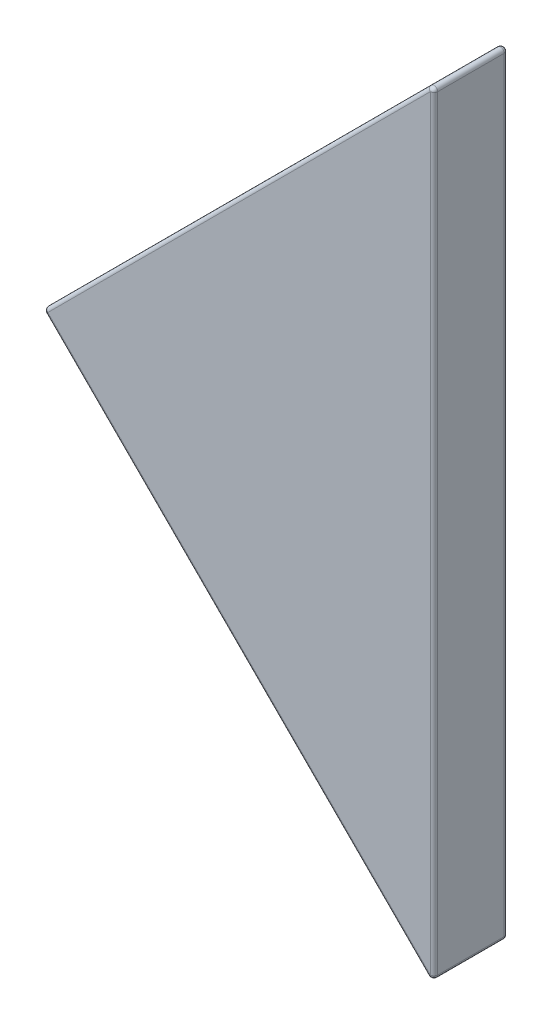
ISO-10303-21;
HEADER;
FILE_DESCRIPTION(('STEP AP214'),'2;1');
FILE_NAME('part.step','',(''),(''),'','','');
FILE_SCHEMA(('AUTOMOTIVE_DESIGN { 1 0 10303 214 1 1 1 1 }'));
ENDSEC;
DATA;
#1=APPLICATION_CONTEXT('core data for automotive mechanical design processes');
#2=APPLICATION_PROTOCOL_DEFINITION('international standard','automotive_design',2000,#1);
#3=PRODUCT_CONTEXT('',#1,'mechanical');
#4=PRODUCT('Part','Part','',(#3));
#5=PRODUCT_RELATED_PRODUCT_CATEGORY('part','',(#4));
#6=PRODUCT_DEFINITION_FORMATION('','',#4);
#7=PRODUCT_DEFINITION_CONTEXT('part definition',#1,'design');
#8=PRODUCT_DEFINITION('design','',#6,#7);
#9=PRODUCT_DEFINITION_SHAPE('','',#8);
#10=(LENGTH_UNIT() NAMED_UNIT(*) SI_UNIT(.MILLI.,.METRE.));
#11=(NAMED_UNIT(*) PLANE_ANGLE_UNIT() SI_UNIT($,.RADIAN.));
#12=(NAMED_UNIT(*) SI_UNIT($,.STERADIAN.) SOLID_ANGLE_UNIT());
#13=UNCERTAINTY_MEASURE_WITH_UNIT(LENGTH_MEASURE(1.E-05),#10,'distance_accuracy_value','');
#14=(GEOMETRIC_REPRESENTATION_CONTEXT(3) GLOBAL_UNCERTAINTY_ASSIGNED_CONTEXT((#13)) GLOBAL_UNIT_ASSIGNED_CONTEXT((#10,
#11,#12)) REPRESENTATION_CONTEXT('',''));
#15=CARTESIAN_POINT('',(0.,0.,0.));
#16=DIRECTION('',(0.,0.,1.));
#17=DIRECTION('',(1.,0.,0.));
#18=AXIS2_PLACEMENT_3D('',#15,#16,#17);
#19=CARTESIAN_POINT('',(-53.0330085889908,53.0330085889913,10.));
#20=DIRECTION('',(0.707106781186544,-0.707106781186551,0.));
#21=DIRECTION('',(0.707106781186551,0.707106781186544,0.));
#22=AXIS2_PLACEMENT_3D('',#19,#20,#21);
#23=PLANE('',#22);
#24=DIRECTION('',(0.,0.,-1.));
#25=VECTOR('',#24,1.);
#26=CARTESIAN_POINT('',(-52.6794551983975,53.3865619795846,10.));
#27=LINE('',#26,#25);
#28=CARTESIAN_POINT('',(-52.6794551983975,53.3865619795846,0.5));
#29=VERTEX_POINT('',#28);
#30=CARTESIAN_POINT('',(-52.6794551983975,53.3865619795846,9.5));
#31=VERTEX_POINT('',#30);
#32=EDGE_CURVE('E113',#29,#31,#27,.F.);
#33=ORIENTED_EDGE('',*,*,#32,.T.);
#34=DIRECTION('',(-0.707106781186551,-0.707106781186544,0.));
#35=VECTOR('',#34,1.);
#36=CARTESIAN_POINT('',(-53.0330085889908,53.0330085889913,9.5));
#37=LINE('',#36,#35);
#38=CARTESIAN_POINT('',(-0.853553390593266,105.212463787388,9.5));
#39=VERTEX_POINT('',#38);
#40=EDGE_CURVE('E145',#31,#39,#37,.F.);
#41=ORIENTED_EDGE('',*,*,#40,.T.);
#42=DIRECTION('',(0.,0.,-1.));
#43=VECTOR('',#42,1.);
#44=CARTESIAN_POINT('',(-0.853553390593273,105.212463787388,10.));
#45=LINE('',#44,#43);
#46=CARTESIAN_POINT('',(-0.853553390593266,105.212463787388,0.5));
#47=VERTEX_POINT('',#46);
#48=EDGE_CURVE('E142',#39,#47,#45,.T.);
#49=ORIENTED_EDGE('',*,*,#48,.T.);
#50=DIRECTION('',(-0.707106781186551,-0.707106781186544,0.));
#51=VECTOR('',#50,1.);
#52=CARTESIAN_POINT('',(-53.0330085889908,53.0330085889913,0.5));
#53=LINE('',#52,#51);
#54=EDGE_CURVE('E137',#47,#29,#53,.T.);
#55=ORIENTED_EDGE('',*,*,#54,.T.);
#56=EDGE_LOOP('',(#33,#41,#49,#55));
#57=FACE_BOUND('',#56,.T.);
#58=ADVANCED_FACE('F33',(#57),#23,.F.);
#59=CARTESIAN_POINT('',(-53.0330085889908,53.0330085889913,10.));
#60=DIRECTION('',(0.707106781186551,0.707106781186544,0.));
#61=DIRECTION('',(-0.707106781186544,0.707106781186551,0.));
#62=AXIS2_PLACEMENT_3D('',#59,#60,#61);
#63=PLANE('',#62);
#64=DIRECTION('',(0.,0.,-1.));
#65=VECTOR('',#64,1.);
#66=CARTESIAN_POINT('',(-0.853553390593273,0.85355339059328,10.));
#67=LINE('',#66,#65);
#68=CARTESIAN_POINT('',(-0.853553390593274,0.853553390593283,0.5));
#69=VERTEX_POINT('',#68);
#70=CARTESIAN_POINT('',(-0.853553390593274,0.853553390593283,9.5));
#71=VERTEX_POINT('',#70);
#72=EDGE_CURVE('E130',#69,#71,#67,.F.);
#73=ORIENTED_EDGE('',*,*,#72,.T.);
#74=DIRECTION('',(0.707106781186544,-0.707106781186551,0.));
#75=VECTOR('',#74,1.);
#76=CARTESIAN_POINT('',(-53.0330085889908,53.0330085889913,9.5));
#77=LINE('',#76,#75);
#78=CARTESIAN_POINT('',(-52.6794551983975,52.6794551983981,9.5));
#79=VERTEX_POINT('',#78);
#80=EDGE_CURVE('E134',#71,#79,#77,.F.);
#81=ORIENTED_EDGE('',*,*,#80,.T.);
#82=DIRECTION('',(0.,0.,-1.));
#83=VECTOR('',#82,1.);
#84=CARTESIAN_POINT('',(-52.6794551983975,52.6794551983981,10.));
#85=LINE('',#84,#83);
#86=CARTESIAN_POINT('',(-52.6794551983975,52.6794551983981,0.5));
#87=VERTEX_POINT('',#86);
#88=EDGE_CURVE('E111',#79,#87,#85,.T.);
#89=ORIENTED_EDGE('',*,*,#88,.T.);
#90=DIRECTION('',(0.707106781186544,-0.707106781186551,0.));
#91=VECTOR('',#90,1.);
#92=CARTESIAN_POINT('',(0.,0.,0.5));
#93=LINE('',#92,#91);
#94=EDGE_CURVE('E125',#87,#69,#93,.T.);
#95=ORIENTED_EDGE('',*,*,#94,.T.);
#96=EDGE_LOOP('',(#73,#81,#89,#95));
#97=FACE_BOUND('',#96,.T.);
#98=ADVANCED_FACE('F132',(#97),#63,.F.);
#99=CARTESIAN_POINT('',(0.,0.,10.));
#100=DIRECTION('',(-1.,0.,0.));
#101=DIRECTION('',(0.,0.,1.));
#102=AXIS2_PLACEMENT_3D('',#99,#100,#101);
#103=PLANE('',#102);
#104=DIRECTION('',(0.,0.,-1.));
#105=VECTOR('',#104,1.);
#106=CARTESIAN_POINT('',(0.,104.858910396795,10.));
#107=LINE('',#106,#105);
#108=CARTESIAN_POINT('',(0.,104.858910396795,0.5));
#109=VERTEX_POINT('',#108);
#110=CARTESIAN_POINT('',(0.,104.858910396795,9.5));
#111=VERTEX_POINT('',#110);
#112=EDGE_CURVE('E149',#109,#111,#107,.F.);
#113=ORIENTED_EDGE('',*,*,#112,.T.);
#114=DIRECTION('',(0.,1.,0.));
#115=VECTOR('',#114,1.);
#116=CARTESIAN_POINT('',(0.,0.,9.5));
#117=LINE('',#116,#115);
#118=CARTESIAN_POINT('',(0.,1.20710678118655,9.5));
#119=VERTEX_POINT('',#118);
#120=EDGE_CURVE('E154',#111,#119,#117,.F.);
#121=ORIENTED_EDGE('',*,*,#120,.T.);
#122=DIRECTION('',(0.,0.,-1.));
#123=VECTOR('',#122,1.);
#124=CARTESIAN_POINT('',(0.,1.20710678118655,10.));
#125=LINE('',#124,#123);
#126=CARTESIAN_POINT('',(0.,1.20710678118655,0.5));
#127=VERTEX_POINT('',#126);
#128=EDGE_CURVE('E151',#119,#127,#125,.T.);
#129=ORIENTED_EDGE('',*,*,#128,.T.);
#130=DIRECTION('',(0.,1.,0.));
#131=VECTOR('',#130,1.);
#132=CARTESIAN_POINT('',(0.,106.066017177982,0.5));
#133=LINE('',#132,#131);
#134=EDGE_CURVE('E147',#127,#109,#133,.T.);
#135=ORIENTED_EDGE('',*,*,#134,.T.);
#136=EDGE_LOOP('',(#113,#121,#129,#135));
#137=FACE_BOUND('',#136,.T.);
#138=ADVANCED_FACE('F229',(#137),#103,.F.);
#139=CARTESIAN_POINT('',(0.,0.,10.));
#140=DIRECTION('',(0.,0.,-1.));
#141=DIRECTION('',(-1.,0.,0.));
#142=AXIS2_PLACEMENT_3D('',#139,#140,#141);
#143=PLANE('',#142);
#144=DIRECTION('',(0.707106781186544,-0.707106781186551,0.));
#145=VECTOR('',#144,1.);
#146=CARTESIAN_POINT('',(0.353553390593276,0.353553390593272,10.));
#147=LINE('',#146,#145);
#148=CARTESIAN_POINT('',(-52.3259018078042,53.0330085889913,10.));
#149=VERTEX_POINT('',#148);
#150=CARTESIAN_POINT('',(-0.5,1.20710678118656,10.));
#151=VERTEX_POINT('',#150);
#152=EDGE_CURVE('E158',#149,#151,#147,.T.);
#153=ORIENTED_EDGE('',*,*,#152,.T.);
#154=DIRECTION('',(0.,1.,0.));
#155=VECTOR('',#154,1.);
#156=CARTESIAN_POINT('',(-0.5,0.,10.));
#157=LINE('',#156,#155);
#158=CARTESIAN_POINT('',(-0.5,104.858910396795,10.));
#159=VERTEX_POINT('',#158);
#160=EDGE_CURVE('E160',#151,#159,#157,.T.);
#161=ORIENTED_EDGE('',*,*,#160,.T.);
#162=DIRECTION('',(-0.707106781186551,-0.707106781186544,0.));
#163=VECTOR('',#162,1.);
#164=CARTESIAN_POINT('',(-52.6794551983975,52.679455198398,10.));
#165=LINE('',#164,#163);
#166=EDGE_CURVE('E156',#159,#149,#165,.T.);
#167=ORIENTED_EDGE('',*,*,#166,.T.);
#168=EDGE_LOOP('',(#153,#161,#167));
#169=FACE_BOUND('',#168,.T.);
#170=ADVANCED_FACE('F215',(#169),#143,.F.);
#171=CARTESIAN_POINT('',(0.,0.,0.));
#172=DIRECTION('',(0.,0.,-1.));
#173=DIRECTION('',(-1.,0.,0.));
#174=AXIS2_PLACEMENT_3D('',#171,#172,#173);
#175=PLANE('',#174);
#176=DIRECTION('',(-0.707106781186551,-0.707106781186544,0.));
#177=VECTOR('',#176,1.);
#178=CARTESIAN_POINT('',(0.353553390593279,105.712463787388,0.));
#179=LINE('',#178,#177);
#180=CARTESIAN_POINT('',(-52.3259018078042,53.0330085889913,0.));
#181=VERTEX_POINT('',#180);
#182=CARTESIAN_POINT('',(-0.500000000000001,104.858910396795,0.));
#183=VERTEX_POINT('',#182);
#184=EDGE_CURVE('E55',#181,#183,#179,.F.);
#185=ORIENTED_EDGE('',*,*,#184,.T.);
#186=DIRECTION('',(0.,1.,0.));
#187=VECTOR('',#186,1.);
#188=CARTESIAN_POINT('',(-0.5,0.,0.));
#189=LINE('',#188,#187);
#190=CARTESIAN_POINT('',(-0.5,1.20710678118655,0.));
#191=VERTEX_POINT('',#190);
#192=EDGE_CURVE('E11',#183,#191,#189,.F.);
#193=ORIENTED_EDGE('',*,*,#192,.T.);
#194=DIRECTION('',(0.707106781186544,-0.707106781186551,0.));
#195=VECTOR('',#194,1.);
#196=CARTESIAN_POINT('',(-52.6794551983975,53.3865619795846,0.));
#197=LINE('',#196,#195);
#198=EDGE_CURVE('E42',#191,#181,#197,.F.);
#199=ORIENTED_EDGE('',*,*,#198,.T.);
#200=EDGE_LOOP('',(#185,#193,#199));
#201=FACE_BOUND('',#200,.T.);
#202=ADVANCED_FACE('F288',(#201),#175,.T.);
#203=CARTESIAN_POINT('',(-0.5,0.,9.5));
#204=DIRECTION('',(0.,1.,0.));
#205=DIRECTION('',(0.,0.,1.));
#206=AXIS2_PLACEMENT_3D('',#203,#204,#205);
#207=CYLINDRICAL_SURFACE('',#206,0.5);
#208=CARTESIAN_POINT('',(-0.5,1.20710678118655,9.5));
#209=DIRECTION('',(0.,-1.,0.));
#210=DIRECTION('',(0.,0.,-1.));
#211=AXIS2_PLACEMENT_3D('',#208,#209,#210);
#212=CIRCLE('',#211,0.5);
#213=EDGE_CURVE('E196',#119,#151,#212,.T.);
#214=ORIENTED_EDGE('',*,*,#213,.F.);
#215=ORIENTED_EDGE('',*,*,#120,.F.);
#216=CARTESIAN_POINT('',(-0.5,104.858910396795,9.5));
#217=DIRECTION('',(0.,1.,0.));
#218=DIRECTION('',(-1.,0.,0.));
#219=AXIS2_PLACEMENT_3D('',#216,#217,#218);
#220=CIRCLE('',#219,0.5);
#221=EDGE_CURVE('E198',#159,#111,#220,.T.);
#222=ORIENTED_EDGE('',*,*,#221,.F.);
#223=ORIENTED_EDGE('',*,*,#160,.F.);
#224=EDGE_LOOP('',(#214,#215,#222,#223));
#225=FACE_BOUND('',#224,.T.);
#226=ADVANCED_FACE('F35',(#225),#207,.T.);
#227=CARTESIAN_POINT('',(-0.5,1.20710678118655,10.));
#228=DIRECTION('',(0.,0.,-1.));
#229=DIRECTION('',(-1.,0.,0.));
#230=AXIS2_PLACEMENT_3D('',#227,#228,#229);
#231=CYLINDRICAL_SURFACE('',#230,0.5);
#232=CARTESIAN_POINT('',(-0.5,1.20710678118655,0.5));
#233=DIRECTION('',(0.,0.,-1.));
#234=DIRECTION('',(-1.,0.,0.));
#235=AXIS2_PLACEMENT_3D('',#232,#233,#234);
#236=CIRCLE('',#235,0.5);
#237=EDGE_CURVE('E190',#127,#69,#236,.T.);
#238=ORIENTED_EDGE('',*,*,#237,.F.);
#239=ORIENTED_EDGE('',*,*,#128,.F.);
#240=CARTESIAN_POINT('',(-0.499999999999998,1.20710678118655,9.5));
#241=DIRECTION('',(0.,0.,1.));
#242=DIRECTION('',(1.,0.,0.));
#243=AXIS2_PLACEMENT_3D('',#240,#241,#242);
#244=CIRCLE('',#243,0.5);
#245=EDGE_CURVE('E193',#71,#119,#244,.T.);
#246=ORIENTED_EDGE('',*,*,#245,.F.);
#247=ORIENTED_EDGE('',*,*,#72,.F.);
#248=EDGE_LOOP('',(#238,#239,#246,#247));
#249=FACE_BOUND('',#248,.T.);
#250=ADVANCED_FACE('F232',(#249),#231,.T.);
#251=CARTESIAN_POINT('',(-0.5,0.,0.5));
#252=DIRECTION('',(0.,-1.,0.));
#253=DIRECTION('',(0.,0.,-1.));
#254=AXIS2_PLACEMENT_3D('',#251,#252,#253);
#255=CYLINDRICAL_SURFACE('',#254,0.5);
#256=CARTESIAN_POINT('',(-0.5,104.858910396795,0.5));
#257=DIRECTION('',(0.,1.,0.));
#258=DIRECTION('',(0.,0.,1.));
#259=AXIS2_PLACEMENT_3D('',#256,#257,#258);
#260=CIRCLE('',#259,0.5);
#261=EDGE_CURVE('E185',#109,#183,#260,.T.);
#262=ORIENTED_EDGE('',*,*,#261,.F.);
#263=ORIENTED_EDGE('',*,*,#134,.F.);
#264=CARTESIAN_POINT('',(-0.5,1.20710678118655,0.5));
#265=DIRECTION('',(0.,-1.,0.));
#266=DIRECTION('',(1.,0.,0.));
#267=AXIS2_PLACEMENT_3D('',#264,#265,#266);
#268=CIRCLE('',#267,0.5);
#269=EDGE_CURVE('E188',#191,#127,#268,.T.);
#270=ORIENTED_EDGE('',*,*,#269,.F.);
#271=ORIENTED_EDGE('',*,*,#192,.F.);
#272=EDGE_LOOP('',(#262,#263,#270,#271));
#273=FACE_BOUND('',#272,.T.);
#274=ADVANCED_FACE('F238',(#273),#255,.T.);
#275=CARTESIAN_POINT('',(-0.5,104.858910396795,10.));
#276=DIRECTION('',(0.,0.,-1.));
#277=DIRECTION('',(-1.,0.,0.));
#278=AXIS2_PLACEMENT_3D('',#275,#276,#277);
#279=CYLINDRICAL_SURFACE('',#278,0.5);
#280=CARTESIAN_POINT('',(-0.5,104.858910396795,9.5));
#281=DIRECTION('',(0.,0.,1.));
#282=DIRECTION('',(1.,0.,0.));
#283=AXIS2_PLACEMENT_3D('',#280,#281,#282);
#284=CIRCLE('',#283,0.5);
#285=EDGE_CURVE('E37',#111,#39,#284,.T.);
#286=ORIENTED_EDGE('',*,*,#285,.F.);
#287=ORIENTED_EDGE('',*,*,#112,.F.);
#288=CARTESIAN_POINT('',(-0.499999999999994,104.858910396795,0.5));
#289=DIRECTION('',(0.,0.,-1.));
#290=DIRECTION('',(-1.,0.,0.));
#291=AXIS2_PLACEMENT_3D('',#288,#289,#290);
#292=CIRCLE('',#291,0.5);
#293=EDGE_CURVE('E182',#47,#109,#292,.T.);
#294=ORIENTED_EDGE('',*,*,#293,.F.);
#295=ORIENTED_EDGE('',*,*,#48,.F.);
#296=EDGE_LOOP('',(#286,#287,#294,#295));
#297=FACE_BOUND('',#296,.T.);
#298=ADVANCED_FACE('F240',(#297),#279,.T.);
#299=CARTESIAN_POINT('',(-0.5,104.858910396795,9.5));
#300=DIRECTION('',(0.,0.,1.));
#301=DIRECTION('',(1.,0.,0.));
#302=AXIS2_PLACEMENT_3D('',#299,#300,#301);
#303=SPHERICAL_SURFACE('',#302,0.5);
#304=ORIENTED_EDGE('',*,*,#221,.T.);
#305=ORIENTED_EDGE('',*,*,#285,.T.);
#306=CARTESIAN_POINT('',(-0.499999999999994,104.858910396795,9.5));
#307=DIRECTION('',(0.707106781186548,0.707106781186547,0.));
#308=DIRECTION('',(-0.707106781186547,0.707106781186548,0.));
#309=AXIS2_PLACEMENT_3D('',#306,#307,#308);
#310=CIRCLE('',#309,0.5);
#311=EDGE_CURVE('E179',#159,#39,#310,.F.);
#312=ORIENTED_EDGE('',*,*,#311,.F.);
#313=EDGE_LOOP('',(#304,#305,#312));
#314=FACE_BOUND('',#313,.T.);
#315=ADVANCED_FACE('F205',(#314),#303,.T.);
#316=CARTESIAN_POINT('',(-0.5,1.20710678118656,9.5));
#317=DIRECTION('',(0.,0.,1.));
#318=DIRECTION('',(1.,0.,0.));
#319=AXIS2_PLACEMENT_3D('',#316,#317,#318);
#320=SPHERICAL_SURFACE('',#319,0.5);
#321=ORIENTED_EDGE('',*,*,#245,.T.);
#322=ORIENTED_EDGE('',*,*,#213,.T.);
#323=CARTESIAN_POINT('',(-0.5,1.20710678118656,9.5));
#324=DIRECTION('',(0.707106781186548,-0.707106781186547,0.));
#325=DIRECTION('',(0.707106781186547,0.707106781186548,0.));
#326=AXIS2_PLACEMENT_3D('',#323,#324,#325);
#327=CIRCLE('',#326,0.5);
#328=EDGE_CURVE('E176',#71,#151,#327,.F.);
#329=ORIENTED_EDGE('',*,*,#328,.F.);
#330=EDGE_LOOP('',(#321,#322,#329));
#331=FACE_BOUND('',#330,.T.);
#332=ADVANCED_FACE('F222',(#331),#320,.T.);
#333=CARTESIAN_POINT('',(-0.5,1.20710678118655,0.5));
#334=DIRECTION('',(0.,0.,1.));
#335=DIRECTION('',(1.,0.,0.));
#336=AXIS2_PLACEMENT_3D('',#333,#334,#335);
#337=SPHERICAL_SURFACE('',#336,0.5);
#338=ORIENTED_EDGE('',*,*,#269,.T.);
#339=ORIENTED_EDGE('',*,*,#237,.T.);
#340=CARTESIAN_POINT('',(-0.499999999999998,1.20710678118655,0.5));
#341=DIRECTION('',(0.707106781186544,-0.707106781186551,0.));
#342=DIRECTION('',(0.707106781186551,0.707106781186544,0.));
#343=AXIS2_PLACEMENT_3D('',#340,#341,#342);
#344=CIRCLE('',#343,0.5);
#345=EDGE_CURVE('E127',#191,#69,#344,.F.);
#346=ORIENTED_EDGE('',*,*,#345,.F.);
#347=EDGE_LOOP('',(#338,#339,#346));
#348=FACE_BOUND('',#347,.T.);
#349=ADVANCED_FACE('F274',(#348),#337,.T.);
#350=CARTESIAN_POINT('',(-0.5,104.858910396795,0.5));
#351=DIRECTION('',(0.,0.,1.));
#352=DIRECTION('',(1.,0.,0.));
#353=AXIS2_PLACEMENT_3D('',#350,#351,#352);
#354=SPHERICAL_SURFACE('',#353,0.5);
#355=ORIENTED_EDGE('',*,*,#293,.T.);
#356=ORIENTED_EDGE('',*,*,#261,.T.);
#357=CARTESIAN_POINT('',(-0.500000000000001,104.858910396795,0.5));
#358=DIRECTION('',(0.707106781186555,0.70710678118654,0.));
#359=DIRECTION('',(-0.70710678118654,0.707106781186555,0.));
#360=AXIS2_PLACEMENT_3D('',#357,#358,#359);
#361=CIRCLE('',#360,0.5);
#362=EDGE_CURVE('E172',#47,#183,#361,.F.);
#363=ORIENTED_EDGE('',*,*,#362,.F.);
#364=EDGE_LOOP('',(#355,#356,#363));
#365=FACE_BOUND('',#364,.T.);
#366=ADVANCED_FACE('F244',(#365),#354,.T.);
#367=CARTESIAN_POINT('',(-52.6794551983975,52.679455198398,9.5));
#368=DIRECTION('',(-0.707106781186551,-0.707106781186544,0.));
#369=DIRECTION('',(0.707106781186544,-0.707106781186551,0.));
#370=AXIS2_PLACEMENT_3D('',#367,#368,#369);
#371=CYLINDRICAL_SURFACE('',#370,0.5);
#372=ORIENTED_EDGE('',*,*,#311,.T.);
#373=ORIENTED_EDGE('',*,*,#40,.F.);
#374=CARTESIAN_POINT('',(-52.3259018078042,53.0330085889913,9.5));
#375=DIRECTION('',(-0.707106781186555,-0.707106781186541,0.));
#376=DIRECTION('',(0.707106781186541,-0.707106781186554,0.));
#377=AXIS2_PLACEMENT_3D('',#374,#375,#376);
#378=CIRCLE('',#377,0.5);
#379=EDGE_CURVE('E169',#149,#31,#378,.T.);
#380=ORIENTED_EDGE('',*,*,#379,.F.);
#381=ORIENTED_EDGE('',*,*,#166,.F.);
#382=EDGE_LOOP('',(#372,#373,#380,#381));
#383=FACE_BOUND('',#382,.T.);
#384=ADVANCED_FACE('F211',(#383),#371,.T.);
#385=CARTESIAN_POINT('',(0.353553390593276,0.353553390593272,9.5));
#386=DIRECTION('',(0.707106781186544,-0.707106781186551,0.));
#387=DIRECTION('',(0.707106781186551,0.707106781186544,0.));
#388=AXIS2_PLACEMENT_3D('',#385,#386,#387);
#389=CYLINDRICAL_SURFACE('',#388,0.5);
#390=ORIENTED_EDGE('',*,*,#328,.T.);
#391=ORIENTED_EDGE('',*,*,#152,.F.);
#392=CARTESIAN_POINT('',(-52.3259018078042,53.0330085889913,9.5));
#393=DIRECTION('',(-0.707106781186547,0.707106781186547,0.));
#394=DIRECTION('',(-0.707106781186548,-0.707106781186548,0.));
#395=AXIS2_PLACEMENT_3D('',#392,#393,#394);
#396=CIRCLE('',#395,0.5);
#397=EDGE_CURVE('E123',#79,#149,#396,.T.);
#398=ORIENTED_EDGE('',*,*,#397,.F.);
#399=ORIENTED_EDGE('',*,*,#80,.F.);
#400=EDGE_LOOP('',(#390,#391,#398,#399));
#401=FACE_BOUND('',#400,.T.);
#402=ADVANCED_FACE('F218',(#401),#389,.T.);
#403=CARTESIAN_POINT('',(-52.6794551983975,53.3865619795846,0.5));
#404=DIRECTION('',(-0.707106781186544,0.707106781186551,0.));
#405=DIRECTION('',(-0.707106781186551,-0.707106781186544,0.));
#406=AXIS2_PLACEMENT_3D('',#403,#404,#405);
#407=CYLINDRICAL_SURFACE('',#406,0.5);
#408=ORIENTED_EDGE('',*,*,#345,.T.);
#409=ORIENTED_EDGE('',*,*,#94,.F.);
#410=CARTESIAN_POINT('',(-52.3259018078042,53.0330085889913,0.5));
#411=DIRECTION('',(-0.707106781186548,0.707106781186548,0.));
#412=DIRECTION('',(-0.707106781186548,-0.707106781186548,0.));
#413=AXIS2_PLACEMENT_3D('',#410,#411,#412);
#414=CIRCLE('',#413,0.5);
#415=EDGE_CURVE('E118',#181,#87,#414,.T.);
#416=ORIENTED_EDGE('',*,*,#415,.F.);
#417=ORIENTED_EDGE('',*,*,#198,.F.);
#418=EDGE_LOOP('',(#408,#409,#416,#417));
#419=FACE_BOUND('',#418,.T.);
#420=ADVANCED_FACE('F126',(#419),#407,.T.);
#421=CARTESIAN_POINT('',(-52.6794551983975,52.6794551983981,0.5));
#422=DIRECTION('',(0.707106781186551,0.707106781186544,0.));
#423=DIRECTION('',(-0.707106781186544,0.707106781186551,0.));
#424=AXIS2_PLACEMENT_3D('',#421,#422,#423);
#425=CYLINDRICAL_SURFACE('',#424,0.5);
#426=ORIENTED_EDGE('',*,*,#362,.T.);
#427=ORIENTED_EDGE('',*,*,#184,.F.);
#428=CARTESIAN_POINT('',(-52.3259018078042,53.0330085889913,0.5));
#429=DIRECTION('',(-0.707106781186547,-0.707106781186547,0.));
#430=DIRECTION('',(0.707106781186548,-0.707106781186548,0.));
#431=AXIS2_PLACEMENT_3D('',#428,#429,#430);
#432=CIRCLE('',#431,0.5);
#433=EDGE_CURVE('E122',#29,#181,#432,.T.);
#434=ORIENTED_EDGE('',*,*,#433,.F.);
#435=ORIENTED_EDGE('',*,*,#54,.F.);
#436=EDGE_LOOP('',(#426,#427,#434,#435));
#437=FACE_BOUND('',#436,.T.);
#438=ADVANCED_FACE('F246',(#437),#425,.T.);
#439=CARTESIAN_POINT('',(-52.3259018078042,53.0330085889913,9.5));
#440=DIRECTION('',(0.,0.,1.));
#441=DIRECTION('',(1.,0.,0.));
#442=AXIS2_PLACEMENT_3D('',#439,#440,#441);
#443=SPHERICAL_SURFACE('',#442,0.5);
#444=ORIENTED_EDGE('',*,*,#397,.T.);
#445=ORIENTED_EDGE('',*,*,#379,.T.);
#446=CARTESIAN_POINT('',(-52.3259018078042,53.0330085889913,9.5));
#447=DIRECTION('',(0.,0.,1.));
#448=DIRECTION('',(1.,0.,0.));
#449=AXIS2_PLACEMENT_3D('',#446,#447,#448);
#450=CIRCLE('',#449,0.5);
#451=EDGE_CURVE('E116',#79,#31,#450,.F.);
#452=ORIENTED_EDGE('',*,*,#451,.F.);
#453=EDGE_LOOP('',(#444,#445,#452));
#454=FACE_BOUND('',#453,.T.);
#455=ADVANCED_FACE('F260',(#454),#443,.T.);
#456=CARTESIAN_POINT('',(-52.3259018078042,53.0330085889913,0.5));
#457=DIRECTION('',(0.,0.,1.));
#458=DIRECTION('',(1.,0.,0.));
#459=AXIS2_PLACEMENT_3D('',#456,#457,#458);
#460=SPHERICAL_SURFACE('',#459,0.5);
#461=ORIENTED_EDGE('',*,*,#433,.T.);
#462=ORIENTED_EDGE('',*,*,#415,.T.);
#463=CARTESIAN_POINT('',(-52.3259018078042,53.0330085889913,0.5));
#464=DIRECTION('',(0.,0.,-1.));
#465=DIRECTION('',(-1.,0.,0.));
#466=AXIS2_PLACEMENT_3D('',#463,#464,#465);
#467=CIRCLE('',#466,0.5);
#468=EDGE_CURVE('E107',#29,#87,#467,.F.);
#469=ORIENTED_EDGE('',*,*,#468,.F.);
#470=EDGE_LOOP('',(#461,#462,#469));
#471=FACE_BOUND('',#470,.T.);
#472=ADVANCED_FACE('F120',(#471),#460,.T.);
#473=CARTESIAN_POINT('',(-52.3259018078042,53.0330085889913,10.));
#474=DIRECTION('',(0.,0.,-1.));
#475=DIRECTION('',(-1.,0.,0.));
#476=AXIS2_PLACEMENT_3D('',#473,#474,#475);
#477=CYLINDRICAL_SURFACE('',#476,0.5);
#478=ORIENTED_EDGE('',*,*,#451,.T.);
#479=ORIENTED_EDGE('',*,*,#32,.F.);
#480=ORIENTED_EDGE('',*,*,#468,.T.);
#481=ORIENTED_EDGE('',*,*,#88,.F.);
#482=EDGE_LOOP('',(#478,#479,#480,#481));
#483=FACE_BOUND('',#482,.T.);
#484=ADVANCED_FACE('F109',(#483),#477,.T.);
#485=CLOSED_SHELL('',(#58,#98,#138,#170,#202,#226,#250,#274,#298,#315,#332,#349,#366,#384,#402,
#420,#438,#455,#472,#484));
#486=MANIFOLD_SOLID_BREP('B2',#485);
#487=ADVANCED_BREP_SHAPE_REPRESENTATION('',(#18,#486),#14);
#488=SHAPE_DEFINITION_REPRESENTATION(#9,#487);
ENDSEC;
END-ISO-10303-21;
